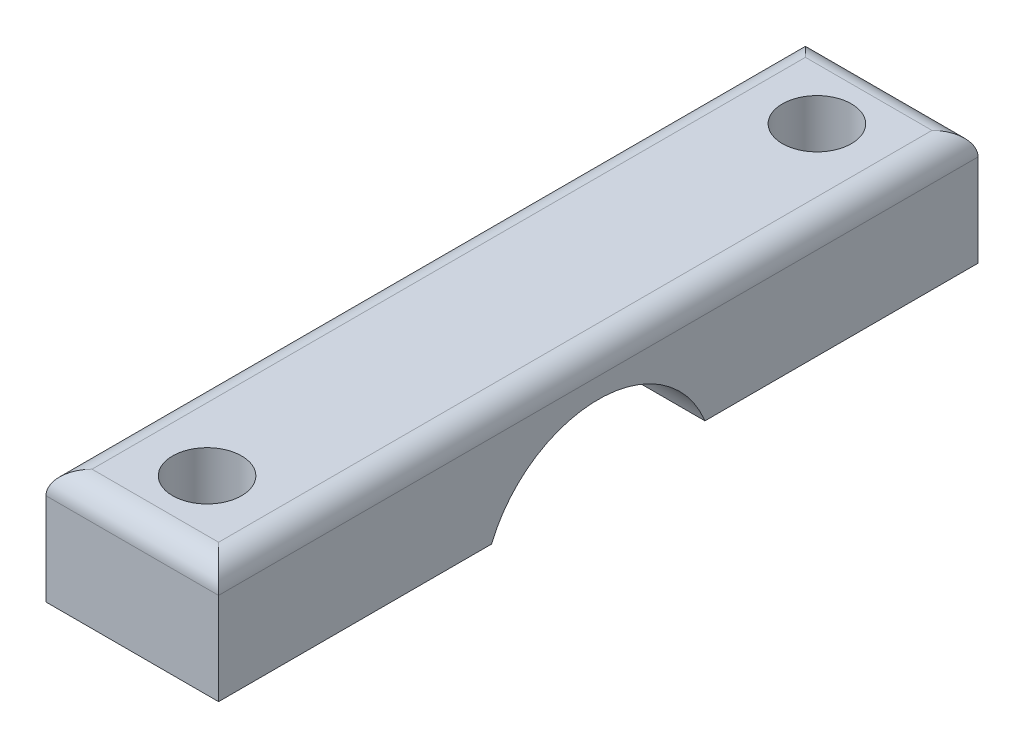
ISO-10303-21;
HEADER;
FILE_DESCRIPTION(('STEP AP214'),'2;1');
FILE_NAME('part.step','',(''),(''),'','','');
FILE_SCHEMA(('AUTOMOTIVE_DESIGN { 1 0 10303 214 1 1 1 1 }'));
ENDSEC;
DATA;
#1=APPLICATION_CONTEXT('core data for automotive mechanical design processes');
#2=APPLICATION_PROTOCOL_DEFINITION('international standard','automotive_design',2000,#1);
#3=PRODUCT_CONTEXT('',#1,'mechanical');
#4=PRODUCT('Part','Part','',(#3));
#5=PRODUCT_RELATED_PRODUCT_CATEGORY('part','',(#4));
#6=PRODUCT_DEFINITION_FORMATION('','',#4);
#7=PRODUCT_DEFINITION_CONTEXT('part definition',#1,'design');
#8=PRODUCT_DEFINITION('design','',#6,#7);
#9=PRODUCT_DEFINITION_SHAPE('','',#8);
#10=(LENGTH_UNIT() NAMED_UNIT(*) SI_UNIT(.MILLI.,.METRE.));
#11=(NAMED_UNIT(*) PLANE_ANGLE_UNIT() SI_UNIT($,.RADIAN.));
#12=(NAMED_UNIT(*) SI_UNIT($,.STERADIAN.) SOLID_ANGLE_UNIT());
#13=UNCERTAINTY_MEASURE_WITH_UNIT(LENGTH_MEASURE(1.E-05),#10,'distance_accuracy_value','');
#14=(GEOMETRIC_REPRESENTATION_CONTEXT(3) GLOBAL_UNCERTAINTY_ASSIGNED_CONTEXT((#13)) GLOBAL_UNIT_ASSIGNED_CONTEXT((#10,
#11,#12)) REPRESENTATION_CONTEXT('',''));
#15=CARTESIAN_POINT('',(0.,0.,0.));
#16=DIRECTION('',(0.,0.,1.));
#17=DIRECTION('',(1.,0.,0.));
#18=AXIS2_PLACEMENT_3D('',#15,#16,#17);
#19=CARTESIAN_POINT('',(0.,0.,0.));
#20=DIRECTION('',(0.,-1.,0.));
#21=DIRECTION('',(0.,0.,-1.));
#22=AXIS2_PLACEMENT_3D('',#19,#20,#21);
#23=PLANE('',#22);
#24=DIRECTION('',(1.,0.,0.));
#25=VECTOR('',#24,1.);
#26=CARTESIAN_POINT('',(0.,0.,-42.2702481088696));
#27=LINE('',#26,#25);
#28=CARTESIAN_POINT('',(0.,0.,-42.2702481088696));
#29=VERTEX_POINT('',#28);
#30=CARTESIAN_POINT('',(15.,0.,-42.2702481088696));
#31=VERTEX_POINT('',#30);
#32=EDGE_CURVE('E55',#29,#31,#27,.T.);
#33=ORIENTED_EDGE('',*,*,#32,.F.);
#34=DIRECTION('',(0.,0.,1.));
#35=VECTOR('',#34,1.);
#36=CARTESIAN_POINT('',(0.,0.,0.));
#37=LINE('',#36,#35);
#38=CARTESIAN_POINT('',(0.,0.,-66.));
#39=VERTEX_POINT('',#38);
#40=EDGE_CURVE('E116',#39,#29,#37,.T.);
#41=ORIENTED_EDGE('',*,*,#40,.F.);
#42=DIRECTION('',(-1.,0.,0.));
#43=VECTOR('',#42,1.);
#44=CARTESIAN_POINT('',(0.,0.,-66.));
#45=LINE('',#44,#43);
#46=CARTESIAN_POINT('',(15.,0.,-66.));
#47=VERTEX_POINT('',#46);
#48=EDGE_CURVE('E136',#47,#39,#45,.T.);
#49=ORIENTED_EDGE('',*,*,#48,.F.);
#50=DIRECTION('',(0.,0.,-1.));
#51=VECTOR('',#50,1.);
#52=CARTESIAN_POINT('',(15.,0.,0.));
#53=LINE('',#52,#51);
#54=EDGE_CURVE('E117',#31,#47,#53,.T.);
#55=ORIENTED_EDGE('',*,*,#54,.F.);
#56=EDGE_LOOP('',(#33,#41,#49,#55));
#57=FACE_BOUND('',#56,.T.);
#58=CARTESIAN_POINT('',(7.5,0.,-59.5));
#59=DIRECTION('',(0.,1.,0.));
#60=DIRECTION('',(0.,0.,1.));
#61=AXIS2_PLACEMENT_3D('',#58,#59,#60);
#62=CIRCLE('',#61,1.75);
#63=CARTESIAN_POINT('',(7.5,0.,-57.75));
#64=VERTEX_POINT('',#63);
#65=EDGE_CURVE('E129',#64,#64,#62,.T.);
#66=ORIENTED_EDGE('',*,*,#65,.T.);
#67=EDGE_LOOP('',(#66));
#68=FACE_BOUND('',#67,.T.);
#69=ADVANCED_FACE('F38',(#57,#68),#23,.T.);
#70=CARTESIAN_POINT('',(7.5,10.,-59.5));
#71=DIRECTION('',(0.,-1.,0.));
#72=DIRECTION('',(0.,0.,-1.));
#73=AXIS2_PLACEMENT_3D('',#70,#71,#72);
#74=CYLINDRICAL_SURFACE('',#73,1.75);
#75=ORIENTED_EDGE('',*,*,#65,.F.);
#76=EDGE_LOOP('',(#75));
#77=FACE_BOUND('',#76,.T.);
#78=CARTESIAN_POINT('',(7.5,4.,-59.5));
#79=DIRECTION('',(0.,1.,0.));
#80=DIRECTION('',(0.,0.,1.));
#81=AXIS2_PLACEMENT_3D('',#78,#79,#80);
#82=CIRCLE('',#81,1.75);
#83=CARTESIAN_POINT('',(7.5,4.,-57.75));
#84=VERTEX_POINT('',#83);
#85=EDGE_CURVE('E151',#84,#84,#82,.T.);
#86=ORIENTED_EDGE('',*,*,#85,.T.);
#87=EDGE_LOOP('',(#86));
#88=FACE_BOUND('',#87,.T.);
#89=ADVANCED_FACE('F198',(#77,#88),#74,.F.);
#90=CARTESIAN_POINT('',(7.5,10.,-6.5));
#91=DIRECTION('',(0.,-1.,0.));
#92=DIRECTION('',(0.,0.,-1.));
#93=AXIS2_PLACEMENT_3D('',#90,#91,#92);
#94=CYLINDRICAL_SURFACE('',#93,1.75);
#95=CARTESIAN_POINT('',(7.5,0.,-6.5));
#96=DIRECTION('',(0.,1.,0.));
#97=DIRECTION('',(0.,0.,1.));
#98=AXIS2_PLACEMENT_3D('',#95,#96,#97);
#99=CIRCLE('',#98,1.75);
#100=CARTESIAN_POINT('',(7.5,0.,-4.75));
#101=VERTEX_POINT('',#100);
#102=EDGE_CURVE('E155',#101,#101,#99,.T.);
#103=ORIENTED_EDGE('',*,*,#102,.F.);
#104=EDGE_LOOP('',(#103));
#105=FACE_BOUND('',#104,.T.);
#106=CARTESIAN_POINT('',(7.5,4.,-6.5));
#107=DIRECTION('',(0.,1.,0.));
#108=DIRECTION('',(0.,0.,1.));
#109=AXIS2_PLACEMENT_3D('',#106,#107,#108);
#110=CIRCLE('',#109,1.75);
#111=CARTESIAN_POINT('',(7.5,4.,-4.75));
#112=VERTEX_POINT('',#111);
#113=EDGE_CURVE('E148',#112,#112,#110,.T.);
#114=ORIENTED_EDGE('',*,*,#113,.T.);
#115=EDGE_LOOP('',(#114));
#116=FACE_BOUND('',#115,.T.);
#117=ADVANCED_FACE('F201',(#105,#116),#94,.F.);
#118=CARTESIAN_POINT('',(0.,10.,0.));
#119=DIRECTION('',(0.,-1.,0.));
#120=DIRECTION('',(0.,0.,-1.));
#121=AXIS2_PLACEMENT_3D('',#118,#119,#120);
#122=PLANE('',#121);
#123=DIRECTION('',(0.,0.,-1.));
#124=VECTOR('',#123,1.);
#125=CARTESIAN_POINT('',(13.,10.,0.));
#126=LINE('',#125,#124);
#127=CARTESIAN_POINT('',(13.,10.,-2.));
#128=VERTEX_POINT('',#127);
#129=CARTESIAN_POINT('',(13.,10.,-64.));
#130=VERTEX_POINT('',#129);
#131=EDGE_CURVE('E147',#128,#130,#126,.T.);
#132=ORIENTED_EDGE('',*,*,#131,.T.);
#133=DIRECTION('',(-1.,0.,0.));
#134=VECTOR('',#133,1.);
#135=CARTESIAN_POINT('',(0.,10.,-64.));
#136=LINE('',#135,#134);
#137=CARTESIAN_POINT('',(2.,10.,-64.));
#138=VERTEX_POINT('',#137);
#139=EDGE_CURVE('E161',#130,#138,#136,.T.);
#140=ORIENTED_EDGE('',*,*,#139,.T.);
#141=DIRECTION('',(0.,0.,1.));
#142=VECTOR('',#141,1.);
#143=CARTESIAN_POINT('',(2.,10.,0.));
#144=LINE('',#143,#142);
#145=CARTESIAN_POINT('',(2.,10.,-2.));
#146=VERTEX_POINT('',#145);
#147=EDGE_CURVE('E159',#138,#146,#144,.T.);
#148=ORIENTED_EDGE('',*,*,#147,.T.);
#149=DIRECTION('',(1.,0.,0.));
#150=VECTOR('',#149,1.);
#151=CARTESIAN_POINT('',(0.,10.,-2.));
#152=LINE('',#151,#150);
#153=EDGE_CURVE('E157',#146,#128,#152,.T.);
#154=ORIENTED_EDGE('',*,*,#153,.T.);
#155=EDGE_LOOP('',(#132,#140,#148,#154));
#156=FACE_BOUND('',#155,.T.);
#157=CARTESIAN_POINT('',(7.5,10.,-59.5));
#158=DIRECTION('',(0.,1.,0.));
#159=DIRECTION('',(0.,0.,1.));
#160=AXIS2_PLACEMENT_3D('',#157,#158,#159);
#161=CIRCLE('',#160,3.);
#162=CARTESIAN_POINT('',(7.5,10.,-56.5));
#163=VERTEX_POINT('',#162);
#164=EDGE_CURVE('E189',#163,#163,#161,.T.);
#165=ORIENTED_EDGE('',*,*,#164,.F.);
#166=EDGE_LOOP('',(#165));
#167=FACE_BOUND('',#166,.T.);
#168=CARTESIAN_POINT('',(7.5,10.,-6.5));
#169=DIRECTION('',(0.,1.,0.));
#170=DIRECTION('',(0.,0.,1.));
#171=AXIS2_PLACEMENT_3D('',#168,#169,#170);
#172=CIRCLE('',#171,3.);
#173=CARTESIAN_POINT('',(7.5,10.,-3.5));
#174=VERTEX_POINT('',#173);
#175=EDGE_CURVE('E179',#174,#174,#172,.T.);
#176=ORIENTED_EDGE('',*,*,#175,.F.);
#177=EDGE_LOOP('',(#176));
#178=FACE_BOUND('',#177,.T.);
#179=ADVANCED_FACE('F254',(#156,#167,#178),#122,.F.);
#180=DIRECTION('',(1.,0.,0.));
#181=VECTOR('',#180,1.);
#182=CARTESIAN_POINT('',(0.,0.,-23.7297518911304));
#183=LINE('',#182,#181);
#184=CARTESIAN_POINT('',(15.,0.,-23.7297518911304));
#185=VERTEX_POINT('',#184);
#186=CARTESIAN_POINT('',(0.,0.,-23.7297518911304));
#187=VERTEX_POINT('',#186);
#188=EDGE_CURVE('E105',#185,#187,#183,.F.);
#189=ORIENTED_EDGE('',*,*,#188,.F.);
#190=CARTESIAN_POINT('',(15.,0.,0.));
#191=VERTEX_POINT('',#190);
#192=EDGE_CURVE('E133',#191,#185,#53,.T.);
#193=ORIENTED_EDGE('',*,*,#192,.F.);
#194=DIRECTION('',(1.,0.,0.));
#195=VECTOR('',#194,1.);
#196=CARTESIAN_POINT('',(0.,0.,0.));
#197=LINE('',#196,#195);
#198=CARTESIAN_POINT('',(0.,0.,0.));
#199=VERTEX_POINT('',#198);
#200=EDGE_CURVE('E124',#199,#191,#197,.T.);
#201=ORIENTED_EDGE('',*,*,#200,.F.);
#202=EDGE_CURVE('E125',#187,#199,#37,.T.);
#203=ORIENTED_EDGE('',*,*,#202,.F.);
#204=EDGE_LOOP('',(#189,#193,#201,#203));
#205=FACE_BOUND('',#204,.T.);
#206=ORIENTED_EDGE('',*,*,#102,.T.);
#207=EDGE_LOOP('',(#206));
#208=FACE_BOUND('',#207,.T.);
#209=ADVANCED_FACE('F219',(#205,#208),#23,.T.);
#210=CARTESIAN_POINT('',(0.,10.,0.));
#211=DIRECTION('',(1.,0.,0.));
#212=DIRECTION('',(0.,0.,-1.));
#213=AXIS2_PLACEMENT_3D('',#210,#211,#212);
#214=PLANE('',#213);
#215=ORIENTED_EDGE('',*,*,#40,.T.);
#216=CARTESIAN_POINT('',(0.,-3.75,-33.));
#217=DIRECTION('',(1.,0.,0.));
#218=DIRECTION('',(0.,0.,-1.));
#219=AXIS2_PLACEMENT_3D('',#216,#217,#218);
#220=CIRCLE('',#219,10.);
#221=EDGE_CURVE('E102',#29,#187,#220,.T.);
#222=ORIENTED_EDGE('',*,*,#221,.T.);
#223=ORIENTED_EDGE('',*,*,#202,.T.);
#224=DIRECTION('',(0.,-1.,0.));
#225=VECTOR('',#224,1.);
#226=CARTESIAN_POINT('',(0.,10.,0.));
#227=LINE('',#226,#225);
#228=CARTESIAN_POINT('',(0.,8.,0.));
#229=VERTEX_POINT('',#228);
#230=EDGE_CURVE('E144',#229,#199,#227,.T.);
#231=ORIENTED_EDGE('',*,*,#230,.F.);
#232=DIRECTION('',(0.,0.,1.));
#233=VECTOR('',#232,1.);
#234=CARTESIAN_POINT('',(0.,8.,0.));
#235=LINE('',#234,#233);
#236=CARTESIAN_POINT('',(0.,8.,-66.));
#237=VERTEX_POINT('',#236);
#238=EDGE_CURVE('E167',#229,#237,#235,.F.);
#239=ORIENTED_EDGE('',*,*,#238,.T.);
#240=DIRECTION('',(0.,-1.,0.));
#241=VECTOR('',#240,1.);
#242=CARTESIAN_POINT('',(0.,10.,-66.));
#243=LINE('',#242,#241);
#244=EDGE_CURVE('E122',#237,#39,#243,.T.);
#245=ORIENTED_EDGE('',*,*,#244,.T.);
#246=EDGE_LOOP('',(#215,#222,#223,#231,#239,#245));
#247=FACE_BOUND('',#246,.T.);
#248=ADVANCED_FACE('F120',(#247),#214,.F.);
#249=CARTESIAN_POINT('',(0.,10.,0.));
#250=DIRECTION('',(0.,0.,-1.));
#251=DIRECTION('',(-1.,0.,0.));
#252=AXIS2_PLACEMENT_3D('',#249,#250,#251);
#253=PLANE('',#252);
#254=DIRECTION('',(0.,-1.,0.));
#255=VECTOR('',#254,1.);
#256=CARTESIAN_POINT('',(15.,10.,0.));
#257=LINE('',#256,#255);
#258=CARTESIAN_POINT('',(15.,8.,0.));
#259=VERTEX_POINT('',#258);
#260=EDGE_CURVE('E142',#259,#191,#257,.T.);
#261=ORIENTED_EDGE('',*,*,#260,.F.);
#262=DIRECTION('',(1.,0.,0.));
#263=VECTOR('',#262,1.);
#264=CARTESIAN_POINT('',(0.,8.,0.));
#265=LINE('',#264,#263);
#266=EDGE_CURVE('E47',#259,#229,#265,.F.);
#267=ORIENTED_EDGE('',*,*,#266,.T.);
#268=ORIENTED_EDGE('',*,*,#230,.T.);
#269=ORIENTED_EDGE('',*,*,#200,.T.);
#270=EDGE_LOOP('',(#261,#267,#268,#269));
#271=FACE_BOUND('',#270,.T.);
#272=ADVANCED_FACE('F224',(#271),#253,.F.);
#273=CARTESIAN_POINT('',(15.,10.,0.));
#274=DIRECTION('',(-1.,0.,0.));
#275=DIRECTION('',(0.,0.,1.));
#276=AXIS2_PLACEMENT_3D('',#273,#274,#275);
#277=PLANE('',#276);
#278=ORIENTED_EDGE('',*,*,#192,.T.);
#279=CARTESIAN_POINT('',(15.,-3.75,-33.));
#280=DIRECTION('',(1.,0.,0.));
#281=DIRECTION('',(0.,0.,-1.));
#282=AXIS2_PLACEMENT_3D('',#279,#280,#281);
#283=CIRCLE('',#282,10.);
#284=EDGE_CURVE('E109',#31,#185,#283,.T.);
#285=ORIENTED_EDGE('',*,*,#284,.F.);
#286=ORIENTED_EDGE('',*,*,#54,.T.);
#287=DIRECTION('',(0.,-1.,0.));
#288=VECTOR('',#287,1.);
#289=CARTESIAN_POINT('',(15.,10.,-66.));
#290=LINE('',#289,#288);
#291=CARTESIAN_POINT('',(15.,8.,-66.));
#292=VERTEX_POINT('',#291);
#293=EDGE_CURVE('E139',#292,#47,#290,.T.);
#294=ORIENTED_EDGE('',*,*,#293,.F.);
#295=DIRECTION('',(0.,0.,-1.));
#296=VECTOR('',#295,1.);
#297=CARTESIAN_POINT('',(15.,8.,0.));
#298=LINE('',#297,#296);
#299=EDGE_CURVE('E11',#292,#259,#298,.F.);
#300=ORIENTED_EDGE('',*,*,#299,.T.);
#301=ORIENTED_EDGE('',*,*,#260,.T.);
#302=EDGE_LOOP('',(#278,#285,#286,#294,#300,#301));
#303=FACE_BOUND('',#302,.T.);
#304=ADVANCED_FACE('F221',(#303),#277,.F.);
#305=CARTESIAN_POINT('',(0.,10.,-66.));
#306=DIRECTION('',(0.,0.,1.));
#307=DIRECTION('',(1.,0.,0.));
#308=AXIS2_PLACEMENT_3D('',#305,#306,#307);
#309=PLANE('',#308);
#310=ORIENTED_EDGE('',*,*,#244,.F.);
#311=DIRECTION('',(-1.,0.,0.));
#312=VECTOR('',#311,1.);
#313=CARTESIAN_POINT('',(0.,8.,-66.));
#314=LINE('',#313,#312);
#315=EDGE_CURVE('E164',#237,#292,#314,.F.);
#316=ORIENTED_EDGE('',*,*,#315,.T.);
#317=ORIENTED_EDGE('',*,*,#293,.T.);
#318=ORIENTED_EDGE('',*,*,#48,.T.);
#319=EDGE_LOOP('',(#310,#316,#317,#318));
#320=FACE_BOUND('',#319,.T.);
#321=ADVANCED_FACE('F236',(#320),#309,.F.);
#322=CARTESIAN_POINT('',(7.5,4.,-6.5));
#323=DIRECTION('',(0.,1.,0.));
#324=DIRECTION('',(0.,0.,1.));
#325=AXIS2_PLACEMENT_3D('',#322,#323,#324);
#326=CYLINDRICAL_SURFACE('',#325,3.);
#327=CARTESIAN_POINT('',(7.5,4.,-6.5));
#328=DIRECTION('',(0.,1.,0.));
#329=DIRECTION('',(0.,0.,1.));
#330=AXIS2_PLACEMENT_3D('',#327,#328,#329);
#331=CIRCLE('',#330,3.);
#332=CARTESIAN_POINT('',(7.5,4.,-3.5));
#333=VERTEX_POINT('',#332);
#334=EDGE_CURVE('E184',#333,#333,#331,.T.);
#335=ORIENTED_EDGE('',*,*,#334,.F.);
#336=EDGE_LOOP('',(#335));
#337=FACE_BOUND('',#336,.T.);
#338=ORIENTED_EDGE('',*,*,#175,.T.);
#339=EDGE_LOOP('',(#338));
#340=FACE_BOUND('',#339,.T.);
#341=ADVANCED_FACE('F238',(#337,#340),#326,.F.);
#342=CARTESIAN_POINT('',(7.5,4.,-6.5));
#343=DIRECTION('',(0.,1.,0.));
#344=DIRECTION('',(0.,0.,1.));
#345=AXIS2_PLACEMENT_3D('',#342,#343,#344);
#346=PLANE('',#345);
#347=ORIENTED_EDGE('',*,*,#113,.F.);
#348=EDGE_LOOP('',(#347));
#349=FACE_BOUND('',#348,.T.);
#350=ORIENTED_EDGE('',*,*,#334,.T.);
#351=EDGE_LOOP('',(#350));
#352=FACE_BOUND('',#351,.T.);
#353=ADVANCED_FACE('F244',(#349,#352),#346,.T.);
#354=CARTESIAN_POINT('',(7.5,4.,-59.5));
#355=DIRECTION('',(0.,1.,0.));
#356=DIRECTION('',(0.,0.,1.));
#357=AXIS2_PLACEMENT_3D('',#354,#355,#356);
#358=CYLINDRICAL_SURFACE('',#357,3.);
#359=CARTESIAN_POINT('',(7.5,4.,-59.5));
#360=DIRECTION('',(0.,1.,0.));
#361=DIRECTION('',(0.,0.,1.));
#362=AXIS2_PLACEMENT_3D('',#359,#360,#361);
#363=CIRCLE('',#362,3.);
#364=CARTESIAN_POINT('',(7.5,4.,-56.5));
#365=VERTEX_POINT('',#364);
#366=EDGE_CURVE('E152',#365,#365,#363,.T.);
#367=ORIENTED_EDGE('',*,*,#366,.F.);
#368=EDGE_LOOP('',(#367));
#369=FACE_BOUND('',#368,.T.);
#370=ORIENTED_EDGE('',*,*,#164,.T.);
#371=EDGE_LOOP('',(#370));
#372=FACE_BOUND('',#371,.T.);
#373=ADVANCED_FACE('F208',(#369,#372),#358,.F.);
#374=CARTESIAN_POINT('',(7.5,4.,-59.5));
#375=DIRECTION('',(0.,1.,0.));
#376=DIRECTION('',(0.,0.,1.));
#377=AXIS2_PLACEMENT_3D('',#374,#375,#376);
#378=PLANE('',#377);
#379=ORIENTED_EDGE('',*,*,#85,.F.);
#380=EDGE_LOOP('',(#379));
#381=FACE_BOUND('',#380,.T.);
#382=ORIENTED_EDGE('',*,*,#366,.T.);
#383=EDGE_LOOP('',(#382));
#384=FACE_BOUND('',#383,.T.);
#385=ADVANCED_FACE('F205',(#381,#384),#378,.T.);
#386=CARTESIAN_POINT('',(0.,8.,-2.));
#387=DIRECTION('',(1.,0.,0.));
#388=DIRECTION('',(0.,0.,-1.));
#389=AXIS2_PLACEMENT_3D('',#386,#387,#388);
#390=CYLINDRICAL_SURFACE('',#389,2.);
#391=CARTESIAN_POINT('',(2.,8.,-2.));
#392=DIRECTION('',(0.707106781186547,0.,0.707106781186547));
#393=DIRECTION('',(0.707106781186547,0.,-0.707106781186547));
#394=AXIS2_PLACEMENT_3D('',#391,#392,#393);
#395=ELLIPSE('',#394,2.82842712474619,2.);
#396=EDGE_CURVE('E172',#229,#146,#395,.F.);
#397=ORIENTED_EDGE('',*,*,#396,.F.);
#398=ORIENTED_EDGE('',*,*,#266,.F.);
#399=CARTESIAN_POINT('',(13.,8.,-2.));
#400=DIRECTION('',(0.707106781186547,0.,-0.707106781186547));
#401=DIRECTION('',(-0.707106781186547,0.,-0.707106781186547));
#402=AXIS2_PLACEMENT_3D('',#399,#400,#401);
#403=ELLIPSE('',#402,2.82842712474619,2.);
#404=EDGE_CURVE('E42',#128,#259,#403,.T.);
#405=ORIENTED_EDGE('',*,*,#404,.F.);
#406=ORIENTED_EDGE('',*,*,#153,.F.);
#407=EDGE_LOOP('',(#397,#398,#405,#406));
#408=FACE_BOUND('',#407,.T.);
#409=ADVANCED_FACE('F40',(#408),#390,.T.);
#410=CARTESIAN_POINT('',(13.,8.,0.));
#411=DIRECTION('',(0.,0.,-1.));
#412=DIRECTION('',(-1.,0.,0.));
#413=AXIS2_PLACEMENT_3D('',#410,#411,#412);
#414=CYLINDRICAL_SURFACE('',#413,2.);
#415=ORIENTED_EDGE('',*,*,#404,.T.);
#416=ORIENTED_EDGE('',*,*,#299,.F.);
#417=CARTESIAN_POINT('',(13.,8.,-64.));
#418=DIRECTION('',(-0.707106781186547,0.,-0.707106781186547));
#419=DIRECTION('',(0.707106781186547,0.,-0.707106781186547));
#420=AXIS2_PLACEMENT_3D('',#417,#418,#419);
#421=ELLIPSE('',#420,2.82842712474619,2.);
#422=EDGE_CURVE('E171',#130,#292,#421,.T.);
#423=ORIENTED_EDGE('',*,*,#422,.F.);
#424=ORIENTED_EDGE('',*,*,#131,.F.);
#425=EDGE_LOOP('',(#415,#416,#423,#424));
#426=FACE_BOUND('',#425,.T.);
#427=ADVANCED_FACE('F281',(#426),#414,.T.);
#428=CARTESIAN_POINT('',(2.,8.,0.));
#429=DIRECTION('',(0.,0.,1.));
#430=DIRECTION('',(1.,0.,0.));
#431=AXIS2_PLACEMENT_3D('',#428,#429,#430);
#432=CYLINDRICAL_SURFACE('',#431,2.);
#433=ORIENTED_EDGE('',*,*,#396,.T.);
#434=ORIENTED_EDGE('',*,*,#147,.F.);
#435=CARTESIAN_POINT('',(2.,8.,-64.));
#436=DIRECTION('',(-0.707106781186547,0.,0.707106781186547));
#437=DIRECTION('',(0.707106781186547,0.,0.707106781186547));
#438=AXIS2_PLACEMENT_3D('',#435,#436,#437);
#439=ELLIPSE('',#438,2.82842712474619,2.);
#440=EDGE_CURVE('E118',#237,#138,#439,.F.);
#441=ORIENTED_EDGE('',*,*,#440,.F.);
#442=ORIENTED_EDGE('',*,*,#238,.F.);
#443=EDGE_LOOP('',(#433,#434,#441,#442));
#444=FACE_BOUND('',#443,.T.);
#445=ADVANCED_FACE('F229',(#444),#432,.T.);
#446=CARTESIAN_POINT('',(0.,8.,-64.));
#447=DIRECTION('',(-1.,0.,0.));
#448=DIRECTION('',(0.,0.,1.));
#449=AXIS2_PLACEMENT_3D('',#446,#447,#448);
#450=CYLINDRICAL_SURFACE('',#449,2.);
#451=ORIENTED_EDGE('',*,*,#422,.T.);
#452=ORIENTED_EDGE('',*,*,#315,.F.);
#453=ORIENTED_EDGE('',*,*,#440,.T.);
#454=ORIENTED_EDGE('',*,*,#139,.F.);
#455=EDGE_LOOP('',(#451,#452,#453,#454));
#456=FACE_BOUND('',#455,.T.);
#457=ADVANCED_FACE('F233',(#456),#450,.T.);
#458=CARTESIAN_POINT('',(0.,-3.75,-33.));
#459=DIRECTION('',(1.,0.,0.));
#460=DIRECTION('',(0.,0.,-1.));
#461=AXIS2_PLACEMENT_3D('',#458,#459,#460);
#462=CYLINDRICAL_SURFACE('',#461,10.);
#463=ORIENTED_EDGE('',*,*,#32,.T.);
#464=ORIENTED_EDGE('',*,*,#284,.T.);
#465=ORIENTED_EDGE('',*,*,#188,.T.);
#466=ORIENTED_EDGE('',*,*,#221,.F.);
#467=EDGE_LOOP('',(#463,#464,#465,#466));
#468=FACE_BOUND('',#467,.T.);
#469=ADVANCED_FACE('F103',(#468),#462,.F.);
#470=CLOSED_SHELL('',(#69,#89,#117,#179,#209,#248,#272,#304,#321,#341,#353,#373,#385,#409,#427,
#445,#457,#469));
#471=MANIFOLD_SOLID_BREP('B2',#470);
#472=ADVANCED_BREP_SHAPE_REPRESENTATION('',(#18,#471),#14);
#473=SHAPE_DEFINITION_REPRESENTATION(#9,#472);
ENDSEC;
END-ISO-10303-21;
